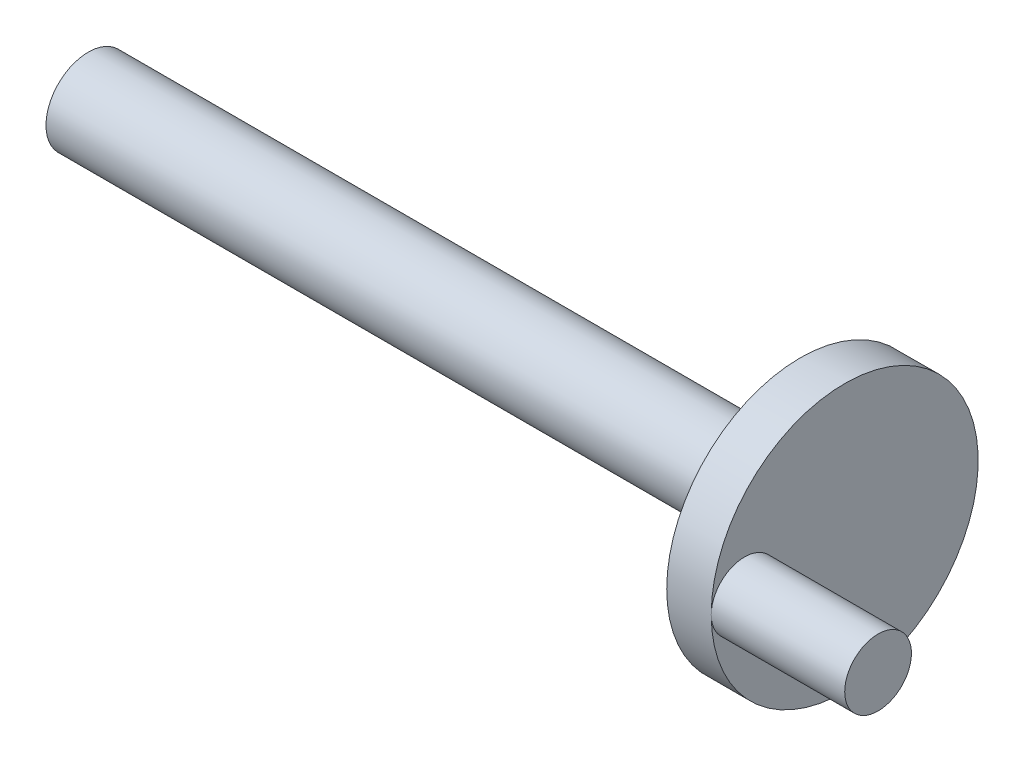
ISO-10303-21;
HEADER;
FILE_DESCRIPTION(('STEP AP214'),'2;1');
FILE_NAME('part.step','',(''),(''),'','','');
FILE_SCHEMA(('AUTOMOTIVE_DESIGN { 1 0 10303 214 1 1 1 1 }'));
ENDSEC;
DATA;
#1=APPLICATION_CONTEXT('core data for automotive mechanical design processes');
#2=APPLICATION_PROTOCOL_DEFINITION('international standard','automotive_design',2000,#1);
#3=PRODUCT_CONTEXT('',#1,'mechanical');
#4=PRODUCT('Part','Part','',(#3));
#5=PRODUCT_RELATED_PRODUCT_CATEGORY('part','',(#4));
#6=PRODUCT_DEFINITION_FORMATION('','',#4);
#7=PRODUCT_DEFINITION_CONTEXT('part definition',#1,'design');
#8=PRODUCT_DEFINITION('design','',#6,#7);
#9=PRODUCT_DEFINITION_SHAPE('','',#8);
#10=(LENGTH_UNIT() NAMED_UNIT(*) SI_UNIT(.MILLI.,.METRE.));
#11=(NAMED_UNIT(*) PLANE_ANGLE_UNIT() SI_UNIT($,.RADIAN.));
#12=(NAMED_UNIT(*) SI_UNIT($,.STERADIAN.) SOLID_ANGLE_UNIT());
#13=UNCERTAINTY_MEASURE_WITH_UNIT(LENGTH_MEASURE(1.E-05),#10,'distance_accuracy_value','');
#14=(GEOMETRIC_REPRESENTATION_CONTEXT(3) GLOBAL_UNCERTAINTY_ASSIGNED_CONTEXT((#13)) GLOBAL_UNIT_ASSIGNED_CONTEXT((#10,
#11,#12)) REPRESENTATION_CONTEXT('',''));
#15=CARTESIAN_POINT('',(0.,0.,0.));
#16=DIRECTION('',(0.,0.,1.));
#17=DIRECTION('',(1.,0.,0.));
#18=AXIS2_PLACEMENT_3D('',#15,#16,#17);
#19=CARTESIAN_POINT('',(20.32,0.,0.));
#20=DIRECTION('',(-1.,0.,0.));
#21=DIRECTION('',(0.,0.,1.));
#22=AXIS2_PLACEMENT_3D('',#19,#20,#21);
#23=CYLINDRICAL_SURFACE('',#22,2.413);
#24=CARTESIAN_POINT('',(-20.32,0.,0.));
#25=DIRECTION('',(1.,0.,0.));
#26=DIRECTION('',(0.,0.,-1.));
#27=AXIS2_PLACEMENT_3D('',#24,#25,#26);
#28=CIRCLE('',#27,2.413);
#29=CARTESIAN_POINT('',(-20.32,1.48106178129071,-1.905));
#30=VERTEX_POINT('',#29);
#31=CARTESIAN_POINT('',(-20.32,-1.48106178129071,-1.905));
#32=VERTEX_POINT('',#31);
#33=EDGE_CURVE('E72',#30,#32,#28,.T.);
#34=ORIENTED_EDGE('',*,*,#33,.T.);
#35=DIRECTION('',(-1.,0.,0.));
#36=VECTOR('',#35,1.);
#37=CARTESIAN_POINT('',(20.32,-1.48106178129071,-1.905));
#38=LINE('',#37,#36);
#39=CARTESIAN_POINT('',(20.32,-1.48106178129071,-1.905));
#40=VERTEX_POINT('',#39);
#41=EDGE_CURVE('E11',#40,#32,#38,.T.);
#42=ORIENTED_EDGE('',*,*,#41,.F.);
#43=CARTESIAN_POINT('',(20.32,0.,0.));
#44=DIRECTION('',(1.,0.,0.));
#45=DIRECTION('',(0.,0.,-1.));
#46=AXIS2_PLACEMENT_3D('',#43,#44,#45);
#47=CIRCLE('',#46,2.413);
#48=CARTESIAN_POINT('',(20.32,1.48106178129071,-1.905));
#49=VERTEX_POINT('',#48);
#50=EDGE_CURVE('E63',#49,#40,#47,.T.);
#51=ORIENTED_EDGE('',*,*,#50,.F.);
#52=DIRECTION('',(-1.,0.,0.));
#53=VECTOR('',#52,1.);
#54=CARTESIAN_POINT('',(20.32,1.48106178129071,-1.905));
#55=LINE('',#54,#53);
#56=EDGE_CURVE('E41',#49,#30,#55,.T.);
#57=ORIENTED_EDGE('',*,*,#56,.T.);
#58=EDGE_LOOP('',(#34,#42,#51,#57));
#59=FACE_BOUND('',#58,.T.);
#60=ADVANCED_FACE('F33',(#59),#23,.T.);
#61=CARTESIAN_POINT('',(20.32,1.48106178129071,-1.905));
#62=DIRECTION('',(0.,0.,1.));
#63=DIRECTION('',(1.,0.,0.));
#64=AXIS2_PLACEMENT_3D('',#61,#62,#63);
#65=PLANE('',#64);
#66=DIRECTION('',(0.,1.,0.));
#67=VECTOR('',#66,1.);
#68=CARTESIAN_POINT('',(-20.32,1.48106178129071,-1.905));
#69=LINE('',#68,#67);
#70=EDGE_CURVE('E57',#32,#30,#69,.T.);
#71=ORIENTED_EDGE('',*,*,#70,.T.);
#72=ORIENTED_EDGE('',*,*,#56,.F.);
#73=DIRECTION('',(0.,1.,0.));
#74=VECTOR('',#73,1.);
#75=CARTESIAN_POINT('',(20.32,1.48106178129071,-1.905));
#76=LINE('',#75,#74);
#77=EDGE_CURVE('E47',#40,#49,#76,.T.);
#78=ORIENTED_EDGE('',*,*,#77,.F.);
#79=ORIENTED_EDGE('',*,*,#41,.T.);
#80=EDGE_LOOP('',(#71,#72,#78,#79));
#81=FACE_BOUND('',#80,.T.);
#82=ADVANCED_FACE('F89',(#81),#65,.F.);
#83=CARTESIAN_POINT('',(-20.32,0.,0.));
#84=DIRECTION('',(1.,0.,0.));
#85=DIRECTION('',(0.,0.,-1.));
#86=AXIS2_PLACEMENT_3D('',#83,#84,#85);
#87=PLANE('',#86);
#88=ORIENTED_EDGE('',*,*,#33,.F.);
#89=ORIENTED_EDGE('',*,*,#70,.F.);
#90=EDGE_LOOP('',(#88,#89));
#91=FACE_BOUND('',#90,.T.);
#92=ADVANCED_FACE('F86',(#91),#87,.F.);
#93=CARTESIAN_POINT('',(20.32,0.,0.));
#94=DIRECTION('',(1.,0.,0.));
#95=DIRECTION('',(0.,0.,-1.));
#96=AXIS2_PLACEMENT_3D('',#93,#94,#95);
#97=PLANE('',#96);
#98=CARTESIAN_POINT('',(20.32,0.,0.));
#99=DIRECTION('',(1.,0.,0.));
#100=DIRECTION('',(0.,0.,-1.));
#101=AXIS2_PLACEMENT_3D('',#98,#99,#100);
#102=CIRCLE('',#101,7.62);
#103=CARTESIAN_POINT('',(20.32,0.,-7.62));
#104=VERTEX_POINT('',#103);
#105=EDGE_CURVE('E73',#104,#104,#102,.T.);
#106=ORIENTED_EDGE('',*,*,#105,.F.);
#107=EDGE_LOOP('',(#106));
#108=FACE_BOUND('',#107,.T.);
#109=ORIENTED_EDGE('',*,*,#77,.T.);
#110=ORIENTED_EDGE('',*,*,#50,.T.);
#111=EDGE_LOOP('',(#109,#110));
#112=FACE_BOUND('',#111,.T.);
#113=ADVANCED_FACE('F88',(#108,#112),#97,.F.);
#114=CARTESIAN_POINT('',(22.86,0.,0.));
#115=DIRECTION('',(-1.,0.,0.));
#116=DIRECTION('',(0.,0.,1.));
#117=AXIS2_PLACEMENT_3D('',#114,#115,#116);
#118=CYLINDRICAL_SURFACE('',#117,7.62);
#119=CARTESIAN_POINT('',(22.86,0.,0.));
#120=DIRECTION('',(1.,0.,0.));
#121=DIRECTION('',(0.,0.,-1.));
#122=AXIS2_PLACEMENT_3D('',#119,#120,#121);
#123=CIRCLE('',#122,7.62);
#124=CARTESIAN_POINT('',(22.86,0.,7.62));
#125=VERTEX_POINT('',#124);
#126=EDGE_CURVE('E67',#125,#125,#123,.T.);
#127=ORIENTED_EDGE('',*,*,#126,.F.);
#128=EDGE_LOOP('',(#127));
#129=FACE_BOUND('',#128,.T.);
#130=ORIENTED_EDGE('',*,*,#105,.T.);
#131=EDGE_LOOP('',(#130));
#132=FACE_BOUND('',#131,.T.);
#133=ADVANCED_FACE('F68',(#129,#132),#118,.T.);
#134=CARTESIAN_POINT('',(22.86,0.,0.));
#135=DIRECTION('',(1.,0.,0.));
#136=DIRECTION('',(0.,0.,-1.));
#137=AXIS2_PLACEMENT_3D('',#134,#135,#136);
#138=PLANE('',#137);
#139=ORIENTED_EDGE('',*,*,#126,.T.);
#140=CARTESIAN_POINT('',(22.86,0.,5.715));
#141=DIRECTION('',(1.,0.,0.));
#142=DIRECTION('',(0.,0.,-1.));
#143=AXIS2_PLACEMENT_3D('',#140,#141,#142);
#144=CIRCLE('',#143,1.905);
#145=EDGE_CURVE('E81',#125,#125,#144,.T.);
#146=ORIENTED_EDGE('',*,*,#145,.F.);
#147=EDGE_LOOP('',(#139,#146));
#148=FACE_BOUND('',#147,.T.);
#149=ADVANCED_FACE('F121',(#148),#138,.T.);
#150=CARTESIAN_POINT('',(30.48,0.,5.715));
#151=DIRECTION('',(-1.,0.,0.));
#152=DIRECTION('',(0.,0.,1.));
#153=AXIS2_PLACEMENT_3D('',#150,#151,#152);
#154=CYLINDRICAL_SURFACE('',#153,1.905);
#155=CARTESIAN_POINT('',(30.48,0.,5.715));
#156=DIRECTION('',(1.,0.,0.));
#157=DIRECTION('',(0.,0.,-1.));
#158=AXIS2_PLACEMENT_3D('',#155,#156,#157);
#159=CIRCLE('',#158,1.905);
#160=CARTESIAN_POINT('',(30.48,0.,3.81));
#161=VERTEX_POINT('',#160);
#162=EDGE_CURVE('E78',#161,#161,#159,.T.);
#163=ORIENTED_EDGE('',*,*,#162,.F.);
#164=EDGE_LOOP('',(#163));
#165=FACE_BOUND('',#164,.T.);
#166=ORIENTED_EDGE('',*,*,#145,.T.);
#167=EDGE_LOOP('',(#166));
#168=FACE_BOUND('',#167,.T.);
#169=ADVANCED_FACE('F129',(#165,#168),#154,.T.);
#170=CARTESIAN_POINT('',(30.48,0.,5.715));
#171=DIRECTION('',(1.,0.,0.));
#172=DIRECTION('',(0.,0.,-1.));
#173=AXIS2_PLACEMENT_3D('',#170,#171,#172);
#174=PLANE('',#173);
#175=ORIENTED_EDGE('',*,*,#162,.T.);
#176=EDGE_LOOP('',(#175));
#177=FACE_BOUND('',#176,.T.);
#178=ADVANCED_FACE('F138',(#177),#174,.T.);
#179=CLOSED_SHELL('',(#60,#82,#92,#113,#133,#149,#169,#178));
#180=MANIFOLD_SOLID_BREP('B2',#179);
#181=ADVANCED_BREP_SHAPE_REPRESENTATION('',(#18,#180),#14);
#182=SHAPE_DEFINITION_REPRESENTATION(#9,#181);
ENDSEC;
END-ISO-10303-21;
